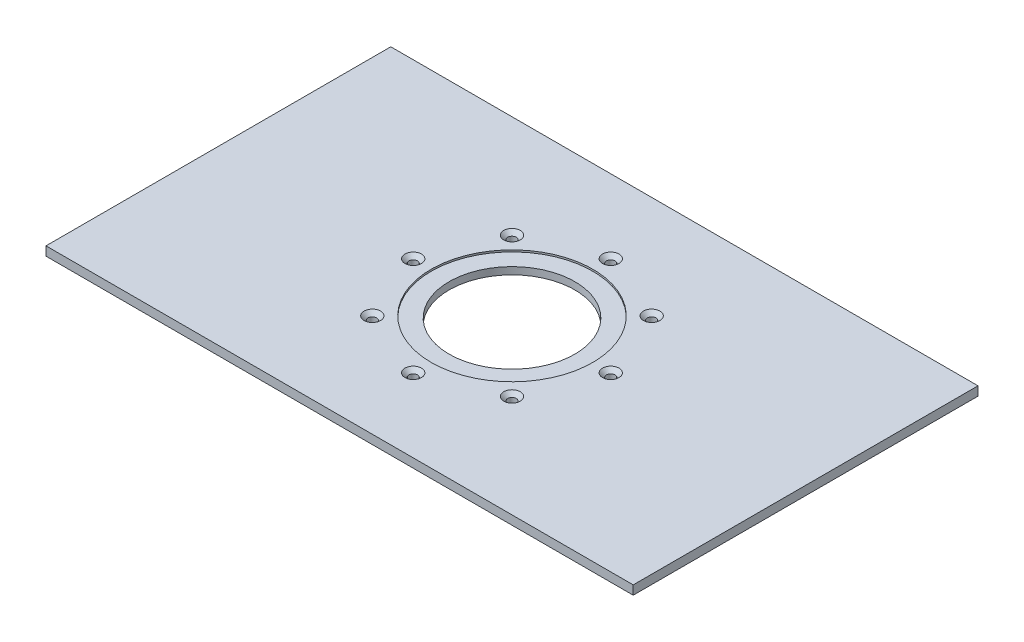
ISO-10303-21;
HEADER;
FILE_DESCRIPTION(('STEP AP214'),'2;1');
FILE_NAME('part.step','',(''),(''),'','','');
FILE_SCHEMA(('AUTOMOTIVE_DESIGN { 1 0 10303 214 1 1 1 1 }'));
ENDSEC;
DATA;
#1=APPLICATION_CONTEXT('core data for automotive mechanical design processes');
#2=APPLICATION_PROTOCOL_DEFINITION('international standard','automotive_design',2000,#1);
#3=PRODUCT_CONTEXT('',#1,'mechanical');
#4=PRODUCT('Part','Part','',(#3));
#5=PRODUCT_RELATED_PRODUCT_CATEGORY('part','',(#4));
#6=PRODUCT_DEFINITION_FORMATION('','',#4);
#7=PRODUCT_DEFINITION_CONTEXT('part definition',#1,'design');
#8=PRODUCT_DEFINITION('design','',#6,#7);
#9=PRODUCT_DEFINITION_SHAPE('','',#8);
#10=(LENGTH_UNIT() NAMED_UNIT(*) SI_UNIT(.MILLI.,.METRE.));
#11=(NAMED_UNIT(*) PLANE_ANGLE_UNIT() SI_UNIT($,.RADIAN.));
#12=(NAMED_UNIT(*) SI_UNIT($,.STERADIAN.) SOLID_ANGLE_UNIT());
#13=UNCERTAINTY_MEASURE_WITH_UNIT(LENGTH_MEASURE(1.E-05),#10,'distance_accuracy_value','');
#14=(GEOMETRIC_REPRESENTATION_CONTEXT(3) GLOBAL_UNCERTAINTY_ASSIGNED_CONTEXT((#13)) GLOBAL_UNIT_ASSIGNED_CONTEXT((#10,
#11,#12)) REPRESENTATION_CONTEXT('',''));
#15=CARTESIAN_POINT('',(0.,0.,0.));
#16=DIRECTION('',(0.,0.,1.));
#17=DIRECTION('',(1.,0.,0.));
#18=AXIS2_PLACEMENT_3D('',#15,#16,#17);
#19=CARTESIAN_POINT('',(0.,0.,0.));
#20=DIRECTION('',(0.,1.,0.));
#21=DIRECTION('',(0.,0.,1.));
#22=AXIS2_PLACEMENT_3D('',#19,#20,#21);
#23=CYLINDRICAL_SURFACE('',#22,35.);
#24=CARTESIAN_POINT('',(0.,0.,0.));
#25=DIRECTION('',(0.,1.,0.));
#26=DIRECTION('',(0.,0.,1.));
#27=AXIS2_PLACEMENT_3D('',#24,#25,#26);
#28=CIRCLE('',#27,35.);
#29=CARTESIAN_POINT('',(0.,0.,35.));
#30=VERTEX_POINT('',#29);
#31=EDGE_CURVE('E119',#30,#30,#28,.T.);
#32=ORIENTED_EDGE('',*,*,#31,.F.);
#33=EDGE_LOOP('',(#32));
#34=FACE_BOUND('',#33,.T.);
#35=CARTESIAN_POINT('',(0.,4.,0.));
#36=DIRECTION('',(0.,1.,0.));
#37=DIRECTION('',(0.,0.,1.));
#38=AXIS2_PLACEMENT_3D('',#35,#36,#37);
#39=CIRCLE('',#38,35.);
#40=CARTESIAN_POINT('',(0.,4.,35.));
#41=VERTEX_POINT('',#40);
#42=EDGE_CURVE('E48',#41,#41,#39,.F.);
#43=ORIENTED_EDGE('',*,*,#42,.F.);
#44=EDGE_LOOP('',(#43));
#45=FACE_BOUND('',#44,.T.);
#46=ADVANCED_FACE('F44',(#34,#45),#23,.F.);
#47=CARTESIAN_POINT('',(163.5,5.,96.));
#48=DIRECTION('',(-1.,0.,0.));
#49=DIRECTION('',(0.,0.,1.));
#50=AXIS2_PLACEMENT_3D('',#47,#48,#49);
#51=PLANE('',#50);
#52=DIRECTION('',(0.,0.,-1.));
#53=VECTOR('',#52,1.);
#54=CARTESIAN_POINT('',(163.5,0.,96.));
#55=LINE('',#54,#53);
#56=CARTESIAN_POINT('',(163.5,0.,96.));
#57=VERTEX_POINT('',#56);
#58=CARTESIAN_POINT('',(163.5,0.,-96.));
#59=VERTEX_POINT('',#58);
#60=EDGE_CURVE('E115',#57,#59,#55,.T.);
#61=ORIENTED_EDGE('',*,*,#60,.T.);
#62=DIRECTION('',(0.,-1.,0.));
#63=VECTOR('',#62,1.);
#64=CARTESIAN_POINT('',(163.5,5.,-96.));
#65=LINE('',#64,#63);
#66=CARTESIAN_POINT('',(163.5,5.,-96.));
#67=VERTEX_POINT('',#66);
#68=EDGE_CURVE('E11',#67,#59,#65,.T.);
#69=ORIENTED_EDGE('',*,*,#68,.F.);
#70=DIRECTION('',(0.,0.,-1.));
#71=VECTOR('',#70,1.);
#72=CARTESIAN_POINT('',(163.5,5.,96.));
#73=LINE('',#72,#71);
#74=CARTESIAN_POINT('',(163.5,5.,96.));
#75=VERTEX_POINT('',#74);
#76=EDGE_CURVE('E98',#75,#67,#73,.T.);
#77=ORIENTED_EDGE('',*,*,#76,.F.);
#78=DIRECTION('',(0.,-1.,0.));
#79=VECTOR('',#78,1.);
#80=CARTESIAN_POINT('',(163.5,5.,96.));
#81=LINE('',#80,#79);
#82=EDGE_CURVE('E111',#75,#57,#81,.T.);
#83=ORIENTED_EDGE('',*,*,#82,.T.);
#84=EDGE_LOOP('',(#61,#69,#77,#83));
#85=FACE_BOUND('',#84,.T.);
#86=ADVANCED_FACE('F46',(#85),#51,.F.);
#87=CARTESIAN_POINT('',(-163.5,5.,-96.));
#88=DIRECTION('',(0.,0.,1.));
#89=DIRECTION('',(1.,0.,0.));
#90=AXIS2_PLACEMENT_3D('',#87,#88,#89);
#91=PLANE('',#90);
#92=DIRECTION('',(-1.,0.,0.));
#93=VECTOR('',#92,1.);
#94=CARTESIAN_POINT('',(-163.5,0.,-96.));
#95=LINE('',#94,#93);
#96=CARTESIAN_POINT('',(-163.5,0.,-96.));
#97=VERTEX_POINT('',#96);
#98=EDGE_CURVE('E103',#59,#97,#95,.T.);
#99=ORIENTED_EDGE('',*,*,#98,.T.);
#100=DIRECTION('',(0.,-1.,0.));
#101=VECTOR('',#100,1.);
#102=CARTESIAN_POINT('',(-163.5,5.,-96.));
#103=LINE('',#102,#101);
#104=CARTESIAN_POINT('',(-163.5,5.,-96.));
#105=VERTEX_POINT('',#104);
#106=EDGE_CURVE('E55',#105,#97,#103,.T.);
#107=ORIENTED_EDGE('',*,*,#106,.F.);
#108=DIRECTION('',(-1.,0.,0.));
#109=VECTOR('',#108,1.);
#110=CARTESIAN_POINT('',(-163.5,5.,-96.));
#111=LINE('',#110,#109);
#112=EDGE_CURVE('E93',#67,#105,#111,.T.);
#113=ORIENTED_EDGE('',*,*,#112,.F.);
#114=ORIENTED_EDGE('',*,*,#68,.T.);
#115=EDGE_LOOP('',(#99,#107,#113,#114));
#116=FACE_BOUND('',#115,.T.);
#117=ADVANCED_FACE('F102',(#116),#91,.F.);
#118=CARTESIAN_POINT('',(-163.5,5.,96.));
#119=DIRECTION('',(1.,0.,0.));
#120=DIRECTION('',(0.,0.,-1.));
#121=AXIS2_PLACEMENT_3D('',#118,#119,#120);
#122=PLANE('',#121);
#123=DIRECTION('',(0.,0.,1.));
#124=VECTOR('',#123,1.);
#125=CARTESIAN_POINT('',(-163.5,0.,96.));
#126=LINE('',#125,#124);
#127=CARTESIAN_POINT('',(-163.5,0.,96.));
#128=VERTEX_POINT('',#127);
#129=EDGE_CURVE('E80',#97,#128,#126,.T.);
#130=ORIENTED_EDGE('',*,*,#129,.T.);
#131=DIRECTION('',(0.,-1.,0.));
#132=VECTOR('',#131,1.);
#133=CARTESIAN_POINT('',(-163.5,5.,96.));
#134=LINE('',#133,#132);
#135=CARTESIAN_POINT('',(-163.5,5.,96.));
#136=VERTEX_POINT('',#135);
#137=EDGE_CURVE('E105',#136,#128,#134,.T.);
#138=ORIENTED_EDGE('',*,*,#137,.F.);
#139=DIRECTION('',(0.,0.,1.));
#140=VECTOR('',#139,1.);
#141=CARTESIAN_POINT('',(-163.5,5.,96.));
#142=LINE('',#141,#140);
#143=EDGE_CURVE('E96',#105,#136,#142,.T.);
#144=ORIENTED_EDGE('',*,*,#143,.F.);
#145=ORIENTED_EDGE('',*,*,#106,.T.);
#146=EDGE_LOOP('',(#130,#138,#144,#145));
#147=FACE_BOUND('',#146,.T.);
#148=ADVANCED_FACE('F107',(#147),#122,.F.);
#149=CARTESIAN_POINT('',(-163.5,5.,96.));
#150=DIRECTION('',(0.,0.,-1.));
#151=DIRECTION('',(-1.,0.,0.));
#152=AXIS2_PLACEMENT_3D('',#149,#150,#151);
#153=PLANE('',#152);
#154=DIRECTION('',(1.,0.,0.));
#155=VECTOR('',#154,1.);
#156=CARTESIAN_POINT('',(-163.5,0.,96.));
#157=LINE('',#156,#155);
#158=EDGE_CURVE('E86',#128,#57,#157,.T.);
#159=ORIENTED_EDGE('',*,*,#158,.T.);
#160=ORIENTED_EDGE('',*,*,#82,.F.);
#161=DIRECTION('',(1.,0.,0.));
#162=VECTOR('',#161,1.);
#163=CARTESIAN_POINT('',(-163.5,5.,96.));
#164=LINE('',#163,#162);
#165=EDGE_CURVE('E63',#136,#75,#164,.T.);
#166=ORIENTED_EDGE('',*,*,#165,.F.);
#167=ORIENTED_EDGE('',*,*,#137,.T.);
#168=EDGE_LOOP('',(#159,#160,#166,#167));
#169=FACE_BOUND('',#168,.T.);
#170=ADVANCED_FACE('F129',(#169),#153,.F.);
#171=CARTESIAN_POINT('',(0.,5.,0.));
#172=DIRECTION('',(0.,-1.,0.));
#173=DIRECTION('',(0.,0.,-1.));
#174=AXIS2_PLACEMENT_3D('',#171,#172,#173);
#175=PLANE('',#174);
#176=CARTESIAN_POINT('',(-55.,5.,0.));
#177=DIRECTION('',(0.,1.,0.));
#178=DIRECTION('',(0.,0.,1.));
#179=AXIS2_PLACEMENT_3D('',#176,#177,#178);
#180=CIRCLE('',#179,4.59);
#181=CARTESIAN_POINT('',(-55.,5.,4.59));
#182=VERTEX_POINT('',#181);
#183=EDGE_CURVE('E239',#182,#182,#180,.T.);
#184=ORIENTED_EDGE('',*,*,#183,.F.);
#185=EDGE_LOOP('',(#184));
#186=FACE_BOUND('',#185,.T.);
#187=CARTESIAN_POINT('',(-38.89087296526,5.,-38.8908729652602));
#188=DIRECTION('',(0.,1.,0.));
#189=DIRECTION('',(0.,0.,1.));
#190=AXIS2_PLACEMENT_3D('',#187,#188,#189);
#191=CIRCLE('',#190,4.59);
#192=CARTESIAN_POINT('',(-38.89087296526,5.,-34.3008729652602));
#193=VERTEX_POINT('',#192);
#194=EDGE_CURVE('E227',#193,#193,#191,.T.);
#195=ORIENTED_EDGE('',*,*,#194,.F.);
#196=EDGE_LOOP('',(#195));
#197=FACE_BOUND('',#196,.T.);
#198=CARTESIAN_POINT('',(1.92031473636372E-13,5.,-55.));
#199=DIRECTION('',(0.,1.,0.));
#200=DIRECTION('',(0.,0.,1.));
#201=AXIS2_PLACEMENT_3D('',#198,#199,#200);
#202=CIRCLE('',#201,4.59);
#203=CARTESIAN_POINT('',(1.92031473636372E-13,5.,-50.41));
#204=VERTEX_POINT('',#203);
#205=EDGE_CURVE('E215',#204,#204,#202,.T.);
#206=ORIENTED_EDGE('',*,*,#205,.F.);
#207=EDGE_LOOP('',(#206));
#208=FACE_BOUND('',#207,.T.);
#209=CARTESIAN_POINT('',(38.8908729652603,5.,-38.8908729652599));
#210=DIRECTION('',(0.,1.,0.));
#211=DIRECTION('',(0.,0.,1.));
#212=AXIS2_PLACEMENT_3D('',#209,#210,#211);
#213=CIRCLE('',#212,4.59);
#214=CARTESIAN_POINT('',(38.8908729652603,5.,-34.3008729652599));
#215=VERTEX_POINT('',#214);
#216=EDGE_CURVE('E203',#215,#215,#213,.T.);
#217=ORIENTED_EDGE('',*,*,#216,.F.);
#218=EDGE_LOOP('',(#217));
#219=FACE_BOUND('',#218,.T.);
#220=CARTESIAN_POINT('',(55.,5.,3.84062947272745E-13));
#221=DIRECTION('',(0.,1.,0.));
#222=DIRECTION('',(0.,0.,1.));
#223=AXIS2_PLACEMENT_3D('',#220,#221,#222);
#224=CIRCLE('',#223,4.59);
#225=CARTESIAN_POINT('',(55.,5.,4.59000000000038));
#226=VERTEX_POINT('',#225);
#227=EDGE_CURVE('E191',#226,#226,#224,.T.);
#228=ORIENTED_EDGE('',*,*,#227,.F.);
#229=EDGE_LOOP('',(#228));
#230=FACE_BOUND('',#229,.T.);
#231=CARTESIAN_POINT('',(38.8908729652598,5.,38.8908729652604));
#232=DIRECTION('',(0.,1.,0.));
#233=DIRECTION('',(0.,0.,1.));
#234=AXIS2_PLACEMENT_3D('',#231,#232,#233);
#235=CIRCLE('',#234,4.59);
#236=CARTESIAN_POINT('',(38.8908729652598,5.,43.4808729652605));
#237=VERTEX_POINT('',#236);
#238=EDGE_CURVE('E179',#237,#237,#235,.T.);
#239=ORIENTED_EDGE('',*,*,#238,.F.);
#240=EDGE_LOOP('',(#239));
#241=FACE_BOUND('',#240,.T.);
#242=CARTESIAN_POINT('',(-5.76094420909117E-13,5.,55.));
#243=DIRECTION('',(0.,1.,0.));
#244=DIRECTION('',(0.,0.,1.));
#245=AXIS2_PLACEMENT_3D('',#242,#243,#244);
#246=CIRCLE('',#245,4.59);
#247=CARTESIAN_POINT('',(-5.76094420909117E-13,5.,59.59));
#248=VERTEX_POINT('',#247);
#249=EDGE_CURVE('E167',#248,#248,#246,.T.);
#250=ORIENTED_EDGE('',*,*,#249,.F.);
#251=EDGE_LOOP('',(#250));
#252=FACE_BOUND('',#251,.T.);
#253=CARTESIAN_POINT('',(-38.8908729652606,5.,38.8908729652596));
#254=DIRECTION('',(0.,1.,0.));
#255=DIRECTION('',(0.,0.,1.));
#256=AXIS2_PLACEMENT_3D('',#253,#254,#255);
#257=CIRCLE('',#256,4.59);
#258=CARTESIAN_POINT('',(-38.8908729652606,5.,43.4808729652596));
#259=VERTEX_POINT('',#258);
#260=EDGE_CURVE('E155',#259,#259,#257,.T.);
#261=ORIENTED_EDGE('',*,*,#260,.F.);
#262=EDGE_LOOP('',(#261));
#263=FACE_BOUND('',#262,.T.);
#264=CARTESIAN_POINT('',(0.,5.,0.));
#265=DIRECTION('',(0.,1.,0.));
#266=DIRECTION('',(0.,0.,1.));
#267=AXIS2_PLACEMENT_3D('',#264,#265,#266);
#268=CIRCLE('',#267,45.);
#269=CARTESIAN_POINT('',(0.,5.,45.));
#270=VERTEX_POINT('',#269);
#271=EDGE_CURVE('E139',#270,#270,#268,.T.);
#272=ORIENTED_EDGE('',*,*,#271,.F.);
#273=EDGE_LOOP('',(#272));
#274=FACE_BOUND('',#273,.T.);
#275=ORIENTED_EDGE('',*,*,#76,.T.);
#276=ORIENTED_EDGE('',*,*,#112,.T.);
#277=ORIENTED_EDGE('',*,*,#143,.T.);
#278=ORIENTED_EDGE('',*,*,#165,.T.);
#279=EDGE_LOOP('',(#275,#276,#277,#278));
#280=FACE_BOUND('',#279,.T.);
#281=ADVANCED_FACE('F94',(#186,#197,#208,#219,#230,#241,#252,#263,#274,#280),#175,.F.);
#282=CARTESIAN_POINT('',(0.,0.,0.));
#283=DIRECTION('',(0.,-1.,0.));
#284=DIRECTION('',(0.,0.,-1.));
#285=AXIS2_PLACEMENT_3D('',#282,#283,#284);
#286=PLANE('',#285);
#287=CARTESIAN_POINT('',(-55.,0.,0.));
#288=DIRECTION('',(0.,1.,0.));
#289=DIRECTION('',(0.,0.,1.));
#290=AXIS2_PLACEMENT_3D('',#287,#288,#289);
#291=CIRCLE('',#290,2.4);
#292=CARTESIAN_POINT('',(-55.,0.,2.4));
#293=VERTEX_POINT('',#292);
#294=EDGE_CURVE('E231',#293,#293,#291,.T.);
#295=ORIENTED_EDGE('',*,*,#294,.T.);
#296=EDGE_LOOP('',(#295));
#297=FACE_BOUND('',#296,.T.);
#298=CARTESIAN_POINT('',(-38.89087296526,0.,-38.8908729652602));
#299=DIRECTION('',(0.,1.,0.));
#300=DIRECTION('',(0.,0.,1.));
#301=AXIS2_PLACEMENT_3D('',#298,#299,#300);
#302=CIRCLE('',#301,2.4);
#303=CARTESIAN_POINT('',(-38.89087296526,0.,-36.4908729652602));
#304=VERTEX_POINT('',#303);
#305=EDGE_CURVE('E219',#304,#304,#302,.T.);
#306=ORIENTED_EDGE('',*,*,#305,.T.);
#307=EDGE_LOOP('',(#306));
#308=FACE_BOUND('',#307,.T.);
#309=CARTESIAN_POINT('',(1.92031473636372E-13,0.,-55.));
#310=DIRECTION('',(0.,1.,0.));
#311=DIRECTION('',(0.,0.,1.));
#312=AXIS2_PLACEMENT_3D('',#309,#310,#311);
#313=CIRCLE('',#312,2.4);
#314=CARTESIAN_POINT('',(1.92031473636372E-13,0.,-52.6));
#315=VERTEX_POINT('',#314);
#316=EDGE_CURVE('E207',#315,#315,#313,.T.);
#317=ORIENTED_EDGE('',*,*,#316,.T.);
#318=EDGE_LOOP('',(#317));
#319=FACE_BOUND('',#318,.T.);
#320=CARTESIAN_POINT('',(38.8908729652603,0.,-38.8908729652599));
#321=DIRECTION('',(0.,1.,0.));
#322=DIRECTION('',(0.,0.,1.));
#323=AXIS2_PLACEMENT_3D('',#320,#321,#322);
#324=CIRCLE('',#323,2.4);
#325=CARTESIAN_POINT('',(38.8908729652603,0.,-36.4908729652599));
#326=VERTEX_POINT('',#325);
#327=EDGE_CURVE('E195',#326,#326,#324,.T.);
#328=ORIENTED_EDGE('',*,*,#327,.T.);
#329=EDGE_LOOP('',(#328));
#330=FACE_BOUND('',#329,.T.);
#331=CARTESIAN_POINT('',(55.,0.,3.84062947272745E-13));
#332=DIRECTION('',(0.,1.,0.));
#333=DIRECTION('',(0.,0.,1.));
#334=AXIS2_PLACEMENT_3D('',#331,#332,#333);
#335=CIRCLE('',#334,2.4);
#336=CARTESIAN_POINT('',(55.,0.,2.40000000000038));
#337=VERTEX_POINT('',#336);
#338=EDGE_CURVE('E183',#337,#337,#335,.T.);
#339=ORIENTED_EDGE('',*,*,#338,.T.);
#340=EDGE_LOOP('',(#339));
#341=FACE_BOUND('',#340,.T.);
#342=CARTESIAN_POINT('',(38.8908729652598,0.,38.8908729652604));
#343=DIRECTION('',(0.,1.,0.));
#344=DIRECTION('',(0.,0.,1.));
#345=AXIS2_PLACEMENT_3D('',#342,#343,#344);
#346=CIRCLE('',#345,2.4);
#347=CARTESIAN_POINT('',(38.8908729652598,0.,41.2908729652604));
#348=VERTEX_POINT('',#347);
#349=EDGE_CURVE('E171',#348,#348,#346,.T.);
#350=ORIENTED_EDGE('',*,*,#349,.T.);
#351=EDGE_LOOP('',(#350));
#352=FACE_BOUND('',#351,.T.);
#353=CARTESIAN_POINT('',(-5.76094420909117E-13,0.,55.));
#354=DIRECTION('',(0.,1.,0.));
#355=DIRECTION('',(0.,0.,1.));
#356=AXIS2_PLACEMENT_3D('',#353,#354,#355);
#357=CIRCLE('',#356,2.4);
#358=CARTESIAN_POINT('',(-5.76094420909117E-13,0.,57.4));
#359=VERTEX_POINT('',#358);
#360=EDGE_CURVE('E159',#359,#359,#357,.T.);
#361=ORIENTED_EDGE('',*,*,#360,.T.);
#362=EDGE_LOOP('',(#361));
#363=FACE_BOUND('',#362,.T.);
#364=CARTESIAN_POINT('',(-38.8908729652606,0.,38.8908729652596));
#365=DIRECTION('',(0.,1.,0.));
#366=DIRECTION('',(0.,0.,1.));
#367=AXIS2_PLACEMENT_3D('',#364,#365,#366);
#368=CIRCLE('',#367,2.4);
#369=CARTESIAN_POINT('',(-38.8908729652606,0.,41.2908729652596));
#370=VERTEX_POINT('',#369);
#371=EDGE_CURVE('E144',#370,#370,#368,.T.);
#372=ORIENTED_EDGE('',*,*,#371,.T.);
#373=EDGE_LOOP('',(#372));
#374=FACE_BOUND('',#373,.T.);
#375=ORIENTED_EDGE('',*,*,#31,.T.);
#376=EDGE_LOOP('',(#375));
#377=FACE_BOUND('',#376,.T.);
#378=ORIENTED_EDGE('',*,*,#60,.F.);
#379=ORIENTED_EDGE('',*,*,#158,.F.);
#380=ORIENTED_EDGE('',*,*,#129,.F.);
#381=ORIENTED_EDGE('',*,*,#98,.F.);
#382=EDGE_LOOP('',(#378,#379,#380,#381));
#383=FACE_BOUND('',#382,.T.);
#384=ADVANCED_FACE('F132',(#297,#308,#319,#330,#341,#352,#363,#374,#377,#383),#286,.T.);
#385=CARTESIAN_POINT('',(0.,4.,0.));
#386=DIRECTION('',(0.,1.,0.));
#387=DIRECTION('',(0.,0.,1.));
#388=AXIS2_PLACEMENT_3D('',#385,#386,#387);
#389=PLANE('',#388);
#390=CARTESIAN_POINT('',(0.,4.,0.));
#391=DIRECTION('',(0.,1.,0.));
#392=DIRECTION('',(0.,0.,1.));
#393=AXIS2_PLACEMENT_3D('',#390,#391,#392);
#394=CIRCLE('',#393,45.);
#395=CARTESIAN_POINT('',(0.,4.,45.));
#396=VERTEX_POINT('',#395);
#397=EDGE_CURVE('E143',#396,#396,#394,.T.);
#398=ORIENTED_EDGE('',*,*,#397,.T.);
#399=EDGE_LOOP('',(#398));
#400=FACE_BOUND('',#399,.T.);
#401=ORIENTED_EDGE('',*,*,#42,.T.);
#402=EDGE_LOOP('',(#401));
#403=FACE_BOUND('',#402,.T.);
#404=ADVANCED_FACE('F268',(#400,#403),#389,.T.);
#405=CARTESIAN_POINT('',(0.,4.,0.));
#406=DIRECTION('',(0.,1.,0.));
#407=DIRECTION('',(0.,0.,1.));
#408=AXIS2_PLACEMENT_3D('',#405,#406,#407);
#409=CYLINDRICAL_SURFACE('',#408,45.);
#410=ORIENTED_EDGE('',*,*,#397,.F.);
#411=EDGE_LOOP('',(#410));
#412=FACE_BOUND('',#411,.T.);
#413=ORIENTED_EDGE('',*,*,#271,.T.);
#414=EDGE_LOOP('',(#413));
#415=FACE_BOUND('',#414,.T.);
#416=ADVANCED_FACE('F265',(#412,#415),#409,.F.);
#417=CARTESIAN_POINT('',(-38.8908729652606,5.,38.8908729652596));
#418=DIRECTION('',(0.,1.,0.));
#419=DIRECTION('',(0.,0.,1.));
#420=AXIS2_PLACEMENT_3D('',#417,#418,#419);
#421=CYLINDRICAL_SURFACE('',#420,2.4);
#422=ORIENTED_EDGE('',*,*,#371,.F.);
#423=EDGE_LOOP('',(#422));
#424=FACE_BOUND('',#423,.T.);
#425=CARTESIAN_POINT('',(-38.8908729652606,2.81,38.8908729652596));
#426=DIRECTION('',(0.,1.,0.));
#427=DIRECTION('',(0.,0.,1.));
#428=AXIS2_PLACEMENT_3D('',#425,#426,#427);
#429=CIRCLE('',#428,2.4);
#430=CARTESIAN_POINT('',(-38.8908729652606,2.81,41.2908729652596));
#431=VERTEX_POINT('',#430);
#432=EDGE_CURVE('E151',#431,#431,#429,.T.);
#433=ORIENTED_EDGE('',*,*,#432,.T.);
#434=EDGE_LOOP('',(#433));
#435=FACE_BOUND('',#434,.T.);
#436=ADVANCED_FACE('F267',(#424,#435),#421,.F.);
#437=CARTESIAN_POINT('',(-38.8908729652606,5.,38.8908729652596));
#438=DIRECTION('',(0.,1.,0.));
#439=DIRECTION('',(0.,0.,1.));
#440=AXIS2_PLACEMENT_3D('',#437,#438,#439);
#441=CONICAL_SURFACE('',#440,4.59,0.785398163397448);
#442=ORIENTED_EDGE('',*,*,#432,.F.);
#443=EDGE_LOOP('',(#442));
#444=FACE_BOUND('',#443,.T.);
#445=ORIENTED_EDGE('',*,*,#260,.T.);
#446=EDGE_LOOP('',(#445));
#447=FACE_BOUND('',#446,.T.);
#448=ADVANCED_FACE('F275',(#444,#447),#441,.F.);
#449=CARTESIAN_POINT('',(-5.76094420909117E-13,5.,55.));
#450=DIRECTION('',(0.,1.,0.));
#451=DIRECTION('',(0.,0.,1.));
#452=AXIS2_PLACEMENT_3D('',#449,#450,#451);
#453=CYLINDRICAL_SURFACE('',#452,2.4);
#454=ORIENTED_EDGE('',*,*,#360,.F.);
#455=EDGE_LOOP('',(#454));
#456=FACE_BOUND('',#455,.T.);
#457=CARTESIAN_POINT('',(-5.76094420909117E-13,2.81,55.));
#458=DIRECTION('',(0.,1.,0.));
#459=DIRECTION('',(0.,0.,1.));
#460=AXIS2_PLACEMENT_3D('',#457,#458,#459);
#461=CIRCLE('',#460,2.4);
#462=CARTESIAN_POINT('',(-5.76094420909117E-13,2.81,57.4));
#463=VERTEX_POINT('',#462);
#464=EDGE_CURVE('E163',#463,#463,#461,.T.);
#465=ORIENTED_EDGE('',*,*,#464,.T.);
#466=EDGE_LOOP('',(#465));
#467=FACE_BOUND('',#466,.T.);
#468=ADVANCED_FACE('F353',(#456,#467),#453,.F.);
#469=CARTESIAN_POINT('',(-5.76094420909117E-13,5.,55.));
#470=DIRECTION('',(0.,1.,0.));
#471=DIRECTION('',(0.,0.,1.));
#472=AXIS2_PLACEMENT_3D('',#469,#470,#471);
#473=CONICAL_SURFACE('',#472,4.59,0.785398163397449);
#474=ORIENTED_EDGE('',*,*,#464,.F.);
#475=EDGE_LOOP('',(#474));
#476=FACE_BOUND('',#475,.T.);
#477=ORIENTED_EDGE('',*,*,#249,.T.);
#478=EDGE_LOOP('',(#477));
#479=FACE_BOUND('',#478,.T.);
#480=ADVANCED_FACE('F363',(#476,#479),#473,.F.);
#481=CARTESIAN_POINT('',(38.8908729652598,5.,38.8908729652604));
#482=DIRECTION('',(0.,1.,0.));
#483=DIRECTION('',(0.,0.,1.));
#484=AXIS2_PLACEMENT_3D('',#481,#482,#483);
#485=CYLINDRICAL_SURFACE('',#484,2.4);
#486=ORIENTED_EDGE('',*,*,#349,.F.);
#487=EDGE_LOOP('',(#486));
#488=FACE_BOUND('',#487,.T.);
#489=CARTESIAN_POINT('',(38.8908729652598,2.81,38.8908729652604));
#490=DIRECTION('',(0.,1.,0.));
#491=DIRECTION('',(0.,0.,1.));
#492=AXIS2_PLACEMENT_3D('',#489,#490,#491);
#493=CIRCLE('',#492,2.4);
#494=CARTESIAN_POINT('',(38.8908729652598,2.81,41.2908729652604));
#495=VERTEX_POINT('',#494);
#496=EDGE_CURVE('E175',#495,#495,#493,.T.);
#497=ORIENTED_EDGE('',*,*,#496,.T.);
#498=EDGE_LOOP('',(#497));
#499=FACE_BOUND('',#498,.T.);
#500=ADVANCED_FACE('F373',(#488,#499),#485,.F.);
#501=CARTESIAN_POINT('',(38.8908729652598,5.,38.8908729652604));
#502=DIRECTION('',(0.,1.,0.));
#503=DIRECTION('',(0.,0.,1.));
#504=AXIS2_PLACEMENT_3D('',#501,#502,#503);
#505=CONICAL_SURFACE('',#504,4.59,0.785398163397449);
#506=ORIENTED_EDGE('',*,*,#496,.F.);
#507=EDGE_LOOP('',(#506));
#508=FACE_BOUND('',#507,.T.);
#509=ORIENTED_EDGE('',*,*,#238,.T.);
#510=EDGE_LOOP('',(#509));
#511=FACE_BOUND('',#510,.T.);
#512=ADVANCED_FACE('F383',(#508,#511),#505,.F.);
#513=CARTESIAN_POINT('',(55.,5.,3.84062947272745E-13));
#514=DIRECTION('',(0.,1.,0.));
#515=DIRECTION('',(0.,0.,1.));
#516=AXIS2_PLACEMENT_3D('',#513,#514,#515);
#517=CYLINDRICAL_SURFACE('',#516,2.4);
#518=ORIENTED_EDGE('',*,*,#338,.F.);
#519=EDGE_LOOP('',(#518));
#520=FACE_BOUND('',#519,.T.);
#521=CARTESIAN_POINT('',(55.,2.81,3.84062947272745E-13));
#522=DIRECTION('',(0.,1.,0.));
#523=DIRECTION('',(0.,0.,1.));
#524=AXIS2_PLACEMENT_3D('',#521,#522,#523);
#525=CIRCLE('',#524,2.4);
#526=CARTESIAN_POINT('',(55.,2.81,2.40000000000038));
#527=VERTEX_POINT('',#526);
#528=EDGE_CURVE('E187',#527,#527,#525,.T.);
#529=ORIENTED_EDGE('',*,*,#528,.T.);
#530=EDGE_LOOP('',(#529));
#531=FACE_BOUND('',#530,.T.);
#532=ADVANCED_FACE('F393',(#520,#531),#517,.F.);
#533=CARTESIAN_POINT('',(55.,5.,3.84062947272745E-13));
#534=DIRECTION('',(0.,1.,0.));
#535=DIRECTION('',(0.,0.,1.));
#536=AXIS2_PLACEMENT_3D('',#533,#534,#535);
#537=CONICAL_SURFACE('',#536,4.59,0.785398163397448);
#538=ORIENTED_EDGE('',*,*,#528,.F.);
#539=EDGE_LOOP('',(#538));
#540=FACE_BOUND('',#539,.T.);
#541=ORIENTED_EDGE('',*,*,#227,.T.);
#542=EDGE_LOOP('',(#541));
#543=FACE_BOUND('',#542,.T.);
#544=ADVANCED_FACE('F403',(#540,#543),#537,.F.);
#545=CARTESIAN_POINT('',(38.8908729652603,5.,-38.8908729652599));
#546=DIRECTION('',(0.,1.,0.));
#547=DIRECTION('',(0.,0.,1.));
#548=AXIS2_PLACEMENT_3D('',#545,#546,#547);
#549=CYLINDRICAL_SURFACE('',#548,2.4);
#550=ORIENTED_EDGE('',*,*,#327,.F.);
#551=EDGE_LOOP('',(#550));
#552=FACE_BOUND('',#551,.T.);
#553=CARTESIAN_POINT('',(38.8908729652603,2.81,-38.8908729652599));
#554=DIRECTION('',(0.,1.,0.));
#555=DIRECTION('',(0.,0.,1.));
#556=AXIS2_PLACEMENT_3D('',#553,#554,#555);
#557=CIRCLE('',#556,2.4);
#558=CARTESIAN_POINT('',(38.8908729652603,2.81,-36.4908729652599));
#559=VERTEX_POINT('',#558);
#560=EDGE_CURVE('E199',#559,#559,#557,.T.);
#561=ORIENTED_EDGE('',*,*,#560,.T.);
#562=EDGE_LOOP('',(#561));
#563=FACE_BOUND('',#562,.T.);
#564=ADVANCED_FACE('F413',(#552,#563),#549,.F.);
#565=CARTESIAN_POINT('',(38.8908729652603,5.,-38.8908729652599));
#566=DIRECTION('',(0.,1.,0.));
#567=DIRECTION('',(0.,0.,1.));
#568=AXIS2_PLACEMENT_3D('',#565,#566,#567);
#569=CONICAL_SURFACE('',#568,4.59,0.785398163397449);
#570=ORIENTED_EDGE('',*,*,#560,.F.);
#571=EDGE_LOOP('',(#570));
#572=FACE_BOUND('',#571,.T.);
#573=ORIENTED_EDGE('',*,*,#216,.T.);
#574=EDGE_LOOP('',(#573));
#575=FACE_BOUND('',#574,.T.);
#576=ADVANCED_FACE('F423',(#572,#575),#569,.F.);
#577=CARTESIAN_POINT('',(1.92031473636372E-13,5.,-55.));
#578=DIRECTION('',(0.,1.,0.));
#579=DIRECTION('',(0.,0.,1.));
#580=AXIS2_PLACEMENT_3D('',#577,#578,#579);
#581=CYLINDRICAL_SURFACE('',#580,2.4);
#582=ORIENTED_EDGE('',*,*,#316,.F.);
#583=EDGE_LOOP('',(#582));
#584=FACE_BOUND('',#583,.T.);
#585=CARTESIAN_POINT('',(1.92031473636372E-13,2.81,-55.));
#586=DIRECTION('',(0.,1.,0.));
#587=DIRECTION('',(0.,0.,1.));
#588=AXIS2_PLACEMENT_3D('',#585,#586,#587);
#589=CIRCLE('',#588,2.4);
#590=CARTESIAN_POINT('',(1.92031473636372E-13,2.81,-52.6));
#591=VERTEX_POINT('',#590);
#592=EDGE_CURVE('E211',#591,#591,#589,.T.);
#593=ORIENTED_EDGE('',*,*,#592,.T.);
#594=EDGE_LOOP('',(#593));
#595=FACE_BOUND('',#594,.T.);
#596=ADVANCED_FACE('F433',(#584,#595),#581,.F.);
#597=CARTESIAN_POINT('',(1.92031473636372E-13,5.,-55.));
#598=DIRECTION('',(0.,1.,0.));
#599=DIRECTION('',(0.,0.,1.));
#600=AXIS2_PLACEMENT_3D('',#597,#598,#599);
#601=CONICAL_SURFACE('',#600,4.59,0.785398163397449);
#602=ORIENTED_EDGE('',*,*,#592,.F.);
#603=EDGE_LOOP('',(#602));
#604=FACE_BOUND('',#603,.T.);
#605=ORIENTED_EDGE('',*,*,#205,.T.);
#606=EDGE_LOOP('',(#605));
#607=FACE_BOUND('',#606,.T.);
#608=ADVANCED_FACE('F443',(#604,#607),#601,.F.);
#609=CARTESIAN_POINT('',(-38.89087296526,5.,-38.8908729652602));
#610=DIRECTION('',(0.,1.,0.));
#611=DIRECTION('',(0.,0.,1.));
#612=AXIS2_PLACEMENT_3D('',#609,#610,#611);
#613=CYLINDRICAL_SURFACE('',#612,2.4);
#614=ORIENTED_EDGE('',*,*,#305,.F.);
#615=EDGE_LOOP('',(#614));
#616=FACE_BOUND('',#615,.T.);
#617=CARTESIAN_POINT('',(-38.89087296526,2.81,-38.8908729652602));
#618=DIRECTION('',(0.,1.,0.));
#619=DIRECTION('',(0.,0.,1.));
#620=AXIS2_PLACEMENT_3D('',#617,#618,#619);
#621=CIRCLE('',#620,2.4);
#622=CARTESIAN_POINT('',(-38.89087296526,2.81,-36.4908729652602));
#623=VERTEX_POINT('',#622);
#624=EDGE_CURVE('E223',#623,#623,#621,.T.);
#625=ORIENTED_EDGE('',*,*,#624,.T.);
#626=EDGE_LOOP('',(#625));
#627=FACE_BOUND('',#626,.T.);
#628=ADVANCED_FACE('F453',(#616,#627),#613,.F.);
#629=CARTESIAN_POINT('',(-38.89087296526,5.,-38.8908729652602));
#630=DIRECTION('',(0.,1.,0.));
#631=DIRECTION('',(0.,0.,1.));
#632=AXIS2_PLACEMENT_3D('',#629,#630,#631);
#633=CONICAL_SURFACE('',#632,4.59,0.785398163397448);
#634=ORIENTED_EDGE('',*,*,#624,.F.);
#635=EDGE_LOOP('',(#634));
#636=FACE_BOUND('',#635,.T.);
#637=ORIENTED_EDGE('',*,*,#194,.T.);
#638=EDGE_LOOP('',(#637));
#639=FACE_BOUND('',#638,.T.);
#640=ADVANCED_FACE('F463',(#636,#639),#633,.F.);
#641=CARTESIAN_POINT('',(-55.,5.,0.));
#642=DIRECTION('',(0.,1.,0.));
#643=DIRECTION('',(0.,0.,1.));
#644=AXIS2_PLACEMENT_3D('',#641,#642,#643);
#645=CYLINDRICAL_SURFACE('',#644,2.4);
#646=ORIENTED_EDGE('',*,*,#294,.F.);
#647=EDGE_LOOP('',(#646));
#648=FACE_BOUND('',#647,.T.);
#649=CARTESIAN_POINT('',(-55.,2.81,0.));
#650=DIRECTION('',(0.,1.,0.));
#651=DIRECTION('',(0.,0.,1.));
#652=AXIS2_PLACEMENT_3D('',#649,#650,#651);
#653=CIRCLE('',#652,2.4);
#654=CARTESIAN_POINT('',(-55.,2.81,2.4));
#655=VERTEX_POINT('',#654);
#656=EDGE_CURVE('E235',#655,#655,#653,.T.);
#657=ORIENTED_EDGE('',*,*,#656,.T.);
#658=EDGE_LOOP('',(#657));
#659=FACE_BOUND('',#658,.T.);
#660=ADVANCED_FACE('F473',(#648,#659),#645,.F.);
#661=CARTESIAN_POINT('',(-55.,5.,0.));
#662=DIRECTION('',(0.,1.,0.));
#663=DIRECTION('',(0.,0.,1.));
#664=AXIS2_PLACEMENT_3D('',#661,#662,#663);
#665=CONICAL_SURFACE('',#664,4.59,0.785398163397448);
#666=ORIENTED_EDGE('',*,*,#656,.F.);
#667=EDGE_LOOP('',(#666));
#668=FACE_BOUND('',#667,.T.);
#669=ORIENTED_EDGE('',*,*,#183,.T.);
#670=EDGE_LOOP('',(#669));
#671=FACE_BOUND('',#670,.T.);
#672=ADVANCED_FACE('F244',(#668,#671),#665,.F.);
#673=CLOSED_SHELL('',(#46,#86,#117,#148,#170,#281,#384,#404,#416,#436,#448,#468,#480,#500,#512,
#532,#544,#564,#576,#596,#608,#628,#640,#660,#672));
#674=MANIFOLD_SOLID_BREP('B2',#673);
#675=ADVANCED_BREP_SHAPE_REPRESENTATION('',(#18,#674),#14);
#676=SHAPE_DEFINITION_REPRESENTATION(#9,#675);
ENDSEC;
END-ISO-10303-21;
